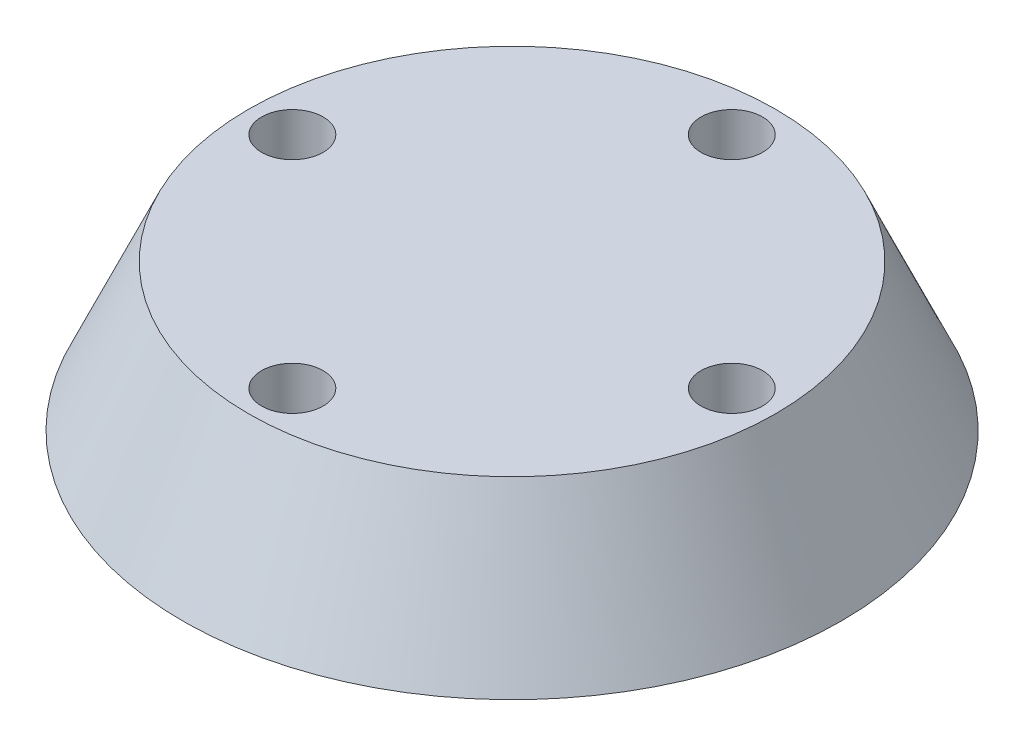
ISO-10303-21;
HEADER;
FILE_DESCRIPTION(('STEP AP214'),'2;1');
FILE_NAME('part.step','',(''),(''),'','','');
FILE_SCHEMA(('AUTOMOTIVE_DESIGN { 1 0 10303 214 1 1 1 1 }'));
ENDSEC;
DATA;
#1=APPLICATION_CONTEXT('core data for automotive mechanical design processes');
#2=APPLICATION_PROTOCOL_DEFINITION('international standard','automotive_design',2000,#1);
#3=PRODUCT_CONTEXT('',#1,'mechanical');
#4=PRODUCT('Part','Part','',(#3));
#5=PRODUCT_RELATED_PRODUCT_CATEGORY('part','',(#4));
#6=PRODUCT_DEFINITION_FORMATION('','',#4);
#7=PRODUCT_DEFINITION_CONTEXT('part definition',#1,'design');
#8=PRODUCT_DEFINITION('design','',#6,#7);
#9=PRODUCT_DEFINITION_SHAPE('','',#8);
#10=(LENGTH_UNIT() NAMED_UNIT(*) SI_UNIT(.MILLI.,.METRE.));
#11=(NAMED_UNIT(*) PLANE_ANGLE_UNIT() SI_UNIT($,.RADIAN.));
#12=(NAMED_UNIT(*) SI_UNIT($,.STERADIAN.) SOLID_ANGLE_UNIT());
#13=UNCERTAINTY_MEASURE_WITH_UNIT(LENGTH_MEASURE(1.E-05),#10,'distance_accuracy_value','');
#14=(GEOMETRIC_REPRESENTATION_CONTEXT(3) GLOBAL_UNCERTAINTY_ASSIGNED_CONTEXT((#13)) GLOBAL_UNIT_ASSIGNED_CONTEXT((#10,
#11,#12)) REPRESENTATION_CONTEXT('',''));
#15=CARTESIAN_POINT('',(0.,0.,0.));
#16=DIRECTION('',(0.,0.,1.));
#17=DIRECTION('',(1.,0.,0.));
#18=AXIS2_PLACEMENT_3D('',#15,#16,#17);
#19=CARTESIAN_POINT('',(0.,0.,0.));
#20=DIRECTION('',(0.,-1.,0.));
#21=DIRECTION('',(1.,0.,0.));
#22=AXIS2_PLACEMENT_3D('',#19,#20,#21);
#23=PLANE('',#22);
#24=CARTESIAN_POINT('',(15.,0.,0.));
#25=DIRECTION('',(0.,1.,0.));
#26=DIRECTION('',(-1.,0.,0.));
#27=AXIS2_PLACEMENT_3D('',#24,#25,#26);
#28=CIRCLE('',#27,2.1);
#29=CARTESIAN_POINT('',(12.9,0.,0.));
#30=VERTEX_POINT('',#29);
#31=EDGE_CURVE('E95',#30,#30,#28,.T.);
#32=ORIENTED_EDGE('',*,*,#31,.F.);
#33=EDGE_LOOP('',(#32));
#34=FACE_BOUND('',#33,.T.);
#35=CARTESIAN_POINT('',(-1.04744440165294E-13,0.,15.));
#36=DIRECTION('',(0.,1.,0.));
#37=DIRECTION('',(-1.,0.,0.));
#38=AXIS2_PLACEMENT_3D('',#35,#36,#37);
#39=CIRCLE('',#38,2.1);
#40=CARTESIAN_POINT('',(-2.1000000000001,0.,15.));
#41=VERTEX_POINT('',#40);
#42=EDGE_CURVE('E92',#41,#41,#39,.T.);
#43=ORIENTED_EDGE('',*,*,#42,.F.);
#44=EDGE_LOOP('',(#43));
#45=FACE_BOUND('',#44,.T.);
#46=CARTESIAN_POINT('',(0.,0.,-15.));
#47=DIRECTION('',(0.,1.,0.));
#48=DIRECTION('',(-1.,0.,0.));
#49=AXIS2_PLACEMENT_3D('',#46,#47,#48);
#50=CIRCLE('',#49,2.1);
#51=CARTESIAN_POINT('',(-2.1,0.,-15.));
#52=VERTEX_POINT('',#51);
#53=EDGE_CURVE('E86',#52,#52,#50,.T.);
#54=ORIENTED_EDGE('',*,*,#53,.F.);
#55=EDGE_LOOP('',(#54));
#56=FACE_BOUND('',#55,.T.);
#57=CARTESIAN_POINT('',(-15.,0.,-1.57116660247941E-13));
#58=DIRECTION('',(0.,1.,0.));
#59=DIRECTION('',(-1.,0.,0.));
#60=AXIS2_PLACEMENT_3D('',#57,#58,#59);
#61=CIRCLE('',#60,2.1);
#62=CARTESIAN_POINT('',(-17.1,0.,-1.57116660247941E-13));
#63=VERTEX_POINT('',#62);
#64=EDGE_CURVE('E80',#63,#63,#61,.T.);
#65=ORIENTED_EDGE('',*,*,#64,.F.);
#66=EDGE_LOOP('',(#65));
#67=FACE_BOUND('',#66,.T.);
#68=CARTESIAN_POINT('',(0.,0.,0.));
#69=DIRECTION('',(0.,-1.,0.));
#70=DIRECTION('',(1.,0.,0.));
#71=AXIS2_PLACEMENT_3D('',#68,#69,#70);
#72=CIRCLE('',#71,18.);
#73=CARTESIAN_POINT('',(18.,0.,0.));
#74=VERTEX_POINT('',#73);
#75=EDGE_CURVE('E10',#74,#74,#72,.T.);
#76=ORIENTED_EDGE('',*,*,#75,.F.);
#77=EDGE_LOOP('',(#76));
#78=FACE_BOUND('',#77,.T.);
#79=ADVANCED_FACE('F39',(#34,#45,#56,#67,#78),#23,.F.);
#80=CARTESIAN_POINT('',(0.,0.,0.));
#81=DIRECTION('',(0.,-1.,0.));
#82=DIRECTION('',(1.,0.,0.));
#83=AXIS2_PLACEMENT_3D('',#80,#81,#82);
#84=CONICAL_SURFACE('',#83,18.,0.42285392613294);
#85=CARTESIAN_POINT('',(0.,-10.,0.));
#86=DIRECTION('',(0.,-1.,0.));
#87=DIRECTION('',(1.,0.,0.));
#88=AXIS2_PLACEMENT_3D('',#85,#86,#87);
#89=CIRCLE('',#88,22.5);
#90=CARTESIAN_POINT('',(22.5,-10.,0.));
#91=VERTEX_POINT('',#90);
#92=EDGE_CURVE('E45',#91,#91,#89,.T.);
#93=ORIENTED_EDGE('',*,*,#92,.F.);
#94=EDGE_LOOP('',(#93));
#95=FACE_BOUND('',#94,.T.);
#96=ORIENTED_EDGE('',*,*,#75,.T.);
#97=EDGE_LOOP('',(#96));
#98=FACE_BOUND('',#97,.T.);
#99=ADVANCED_FACE('F112',(#95,#98),#84,.T.);
#100=CARTESIAN_POINT('',(22.5,-9.99999999999999,0.));
#101=DIRECTION('',(0.,1.,0.));
#102=DIRECTION('',(-1.,0.,0.));
#103=AXIS2_PLACEMENT_3D('',#100,#101,#102);
#104=PLANE('',#103);
#105=CARTESIAN_POINT('',(0.,-10.,18.));
#106=DIRECTION('',(0.,1.,0.));
#107=DIRECTION('',(0.,0.,1.));
#108=AXIS2_PLACEMENT_3D('',#105,#106,#107);
#109=CIRCLE('',#108,2.1);
#110=CARTESIAN_POINT('',(0.,-10.,20.1));
#111=VERTEX_POINT('',#110);
#112=EDGE_CURVE('E53',#111,#111,#109,.T.);
#113=ORIENTED_EDGE('',*,*,#112,.T.);
#114=EDGE_LOOP('',(#113));
#115=FACE_BOUND('',#114,.T.);
#116=CARTESIAN_POINT('',(-18.,-10.,0.));
#117=DIRECTION('',(0.,1.,0.));
#118=DIRECTION('',(0.,0.,1.));
#119=AXIS2_PLACEMENT_3D('',#116,#117,#118);
#120=CIRCLE('',#119,2.1);
#121=CARTESIAN_POINT('',(-18.,-10.,2.1));
#122=VERTEX_POINT('',#121);
#123=EDGE_CURVE('E72',#122,#122,#120,.T.);
#124=ORIENTED_EDGE('',*,*,#123,.T.);
#125=EDGE_LOOP('',(#124));
#126=FACE_BOUND('',#125,.T.);
#127=CARTESIAN_POINT('',(0.,-10.,-18.));
#128=DIRECTION('',(0.,1.,0.));
#129=DIRECTION('',(0.,0.,1.));
#130=AXIS2_PLACEMENT_3D('',#127,#128,#129);
#131=CIRCLE('',#130,2.1);
#132=CARTESIAN_POINT('',(0.,-10.,-15.9));
#133=VERTEX_POINT('',#132);
#134=EDGE_CURVE('E66',#133,#133,#131,.T.);
#135=ORIENTED_EDGE('',*,*,#134,.T.);
#136=EDGE_LOOP('',(#135));
#137=FACE_BOUND('',#136,.T.);
#138=CARTESIAN_POINT('',(18.,-10.,0.));
#139=DIRECTION('',(0.,1.,0.));
#140=DIRECTION('',(0.,0.,1.));
#141=AXIS2_PLACEMENT_3D('',#138,#139,#140);
#142=CIRCLE('',#141,2.1);
#143=CARTESIAN_POINT('',(18.,-10.,2.1));
#144=VERTEX_POINT('',#143);
#145=EDGE_CURVE('E59',#144,#144,#142,.T.);
#146=ORIENTED_EDGE('',*,*,#145,.T.);
#147=EDGE_LOOP('',(#146));
#148=FACE_BOUND('',#147,.T.);
#149=ORIENTED_EDGE('',*,*,#92,.T.);
#150=EDGE_LOOP('',(#149));
#151=FACE_BOUND('',#150,.T.);
#152=ADVANCED_FACE('F164',(#115,#126,#137,#148,#151),#104,.F.);
#153=CARTESIAN_POINT('',(18.,-6.,0.));
#154=DIRECTION('',(0.,-1.,0.));
#155=DIRECTION('',(0.,0.,-1.));
#156=AXIS2_PLACEMENT_3D('',#153,#154,#155);
#157=CYLINDRICAL_SURFACE('',#156,2.1);
#158=CARTESIAN_POINT('',(18.,-6.,0.));
#159=DIRECTION('',(0.,1.,0.));
#160=DIRECTION('',(0.,0.,1.));
#161=AXIS2_PLACEMENT_3D('',#158,#159,#160);
#162=CIRCLE('',#161,2.1);
#163=CARTESIAN_POINT('',(18.,-6.,2.1));
#164=VERTEX_POINT('',#163);
#165=EDGE_CURVE('E56',#164,#164,#162,.T.);
#166=ORIENTED_EDGE('',*,*,#165,.T.);
#167=EDGE_LOOP('',(#166));
#168=FACE_BOUND('',#167,.T.);
#169=ORIENTED_EDGE('',*,*,#145,.F.);
#170=EDGE_LOOP('',(#169));
#171=FACE_BOUND('',#170,.T.);
#172=ADVANCED_FACE('F161',(#168,#171),#157,.F.);
#173=CARTESIAN_POINT('',(18.,-6.,0.));
#174=DIRECTION('',(0.,1.,0.));
#175=DIRECTION('',(0.,0.,1.));
#176=AXIS2_PLACEMENT_3D('',#173,#174,#175);
#177=PLANE('',#176);
#178=ORIENTED_EDGE('',*,*,#165,.F.);
#179=EDGE_LOOP('',(#178));
#180=FACE_BOUND('',#179,.T.);
#181=ADVANCED_FACE('F156',(#180),#177,.F.);
#182=CARTESIAN_POINT('',(0.,-6.,-18.));
#183=DIRECTION('',(0.,-1.,0.));
#184=DIRECTION('',(0.,0.,-1.));
#185=AXIS2_PLACEMENT_3D('',#182,#183,#184);
#186=CYLINDRICAL_SURFACE('',#185,2.1);
#187=CARTESIAN_POINT('',(0.,-6.,-18.));
#188=DIRECTION('',(0.,1.,0.));
#189=DIRECTION('',(0.,0.,1.));
#190=AXIS2_PLACEMENT_3D('',#187,#188,#189);
#191=CIRCLE('',#190,2.1);
#192=CARTESIAN_POINT('',(0.,-6.,-15.9));
#193=VERTEX_POINT('',#192);
#194=EDGE_CURVE('E63',#193,#193,#191,.T.);
#195=ORIENTED_EDGE('',*,*,#194,.T.);
#196=EDGE_LOOP('',(#195));
#197=FACE_BOUND('',#196,.T.);
#198=ORIENTED_EDGE('',*,*,#134,.F.);
#199=EDGE_LOOP('',(#198));
#200=FACE_BOUND('',#199,.T.);
#201=ADVANCED_FACE('F153',(#197,#200),#186,.F.);
#202=CARTESIAN_POINT('',(0.,-6.,-18.));
#203=DIRECTION('',(0.,1.,0.));
#204=DIRECTION('',(0.,0.,1.));
#205=AXIS2_PLACEMENT_3D('',#202,#203,#204);
#206=PLANE('',#205);
#207=ORIENTED_EDGE('',*,*,#194,.F.);
#208=EDGE_LOOP('',(#207));
#209=FACE_BOUND('',#208,.T.);
#210=ADVANCED_FACE('F148',(#209),#206,.F.);
#211=CARTESIAN_POINT('',(-18.,-6.,0.));
#212=DIRECTION('',(0.,-1.,0.));
#213=DIRECTION('',(0.,0.,-1.));
#214=AXIS2_PLACEMENT_3D('',#211,#212,#213);
#215=CYLINDRICAL_SURFACE('',#214,2.1);
#216=CARTESIAN_POINT('',(-18.,-6.,0.));
#217=DIRECTION('',(0.,1.,0.));
#218=DIRECTION('',(0.,0.,1.));
#219=AXIS2_PLACEMENT_3D('',#216,#217,#218);
#220=CIRCLE('',#219,2.1);
#221=CARTESIAN_POINT('',(-18.,-6.,2.1));
#222=VERTEX_POINT('',#221);
#223=EDGE_CURVE('E69',#222,#222,#220,.T.);
#224=ORIENTED_EDGE('',*,*,#223,.T.);
#225=EDGE_LOOP('',(#224));
#226=FACE_BOUND('',#225,.T.);
#227=ORIENTED_EDGE('',*,*,#123,.F.);
#228=EDGE_LOOP('',(#227));
#229=FACE_BOUND('',#228,.T.);
#230=ADVANCED_FACE('F145',(#226,#229),#215,.F.);
#231=CARTESIAN_POINT('',(-18.,-6.,0.));
#232=DIRECTION('',(0.,1.,0.));
#233=DIRECTION('',(0.,0.,1.));
#234=AXIS2_PLACEMENT_3D('',#231,#232,#233);
#235=PLANE('',#234);
#236=ORIENTED_EDGE('',*,*,#223,.F.);
#237=EDGE_LOOP('',(#236));
#238=FACE_BOUND('',#237,.T.);
#239=ADVANCED_FACE('F143',(#238),#235,.F.);
#240=CARTESIAN_POINT('',(0.,-6.,18.));
#241=DIRECTION('',(0.,-1.,0.));
#242=DIRECTION('',(0.,0.,-1.));
#243=AXIS2_PLACEMENT_3D('',#240,#241,#242);
#244=CYLINDRICAL_SURFACE('',#243,2.1);
#245=CARTESIAN_POINT('',(0.,-6.,18.));
#246=DIRECTION('',(0.,1.,0.));
#247=DIRECTION('',(0.,0.,1.));
#248=AXIS2_PLACEMENT_3D('',#245,#246,#247);
#249=CIRCLE('',#248,2.1);
#250=CARTESIAN_POINT('',(0.,-6.,20.1));
#251=VERTEX_POINT('',#250);
#252=EDGE_CURVE('E49',#251,#251,#249,.T.);
#253=ORIENTED_EDGE('',*,*,#252,.T.);
#254=EDGE_LOOP('',(#253));
#255=FACE_BOUND('',#254,.T.);
#256=ORIENTED_EDGE('',*,*,#112,.F.);
#257=EDGE_LOOP('',(#256));
#258=FACE_BOUND('',#257,.T.);
#259=ADVANCED_FACE('F133',(#255,#258),#244,.F.);
#260=CARTESIAN_POINT('',(0.,-6.,18.));
#261=DIRECTION('',(0.,1.,0.));
#262=DIRECTION('',(0.,0.,1.));
#263=AXIS2_PLACEMENT_3D('',#260,#261,#262);
#264=PLANE('',#263);
#265=ORIENTED_EDGE('',*,*,#252,.F.);
#266=EDGE_LOOP('',(#265));
#267=FACE_BOUND('',#266,.T.);
#268=ADVANCED_FACE('F123',(#267),#264,.F.);
#269=CARTESIAN_POINT('',(-15.,-4.00000000000001,-1.57116660247941E-13));
#270=DIRECTION('',(0.,1.,0.));
#271=DIRECTION('',(-1.,0.,0.));
#272=AXIS2_PLACEMENT_3D('',#269,#270,#271);
#273=CYLINDRICAL_SURFACE('',#272,2.1);
#274=CARTESIAN_POINT('',(-15.,-4.00000000000001,-1.57116660247941E-13));
#275=DIRECTION('',(0.,1.,0.));
#276=DIRECTION('',(-1.,0.,0.));
#277=AXIS2_PLACEMENT_3D('',#274,#275,#276);
#278=CIRCLE('',#277,2.1);
#279=CARTESIAN_POINT('',(-17.1,-4.00000000000001,-1.57116660247941E-13));
#280=VERTEX_POINT('',#279);
#281=EDGE_CURVE('E77',#280,#280,#278,.T.);
#282=ORIENTED_EDGE('',*,*,#281,.F.);
#283=EDGE_LOOP('',(#282));
#284=FACE_BOUND('',#283,.T.);
#285=ORIENTED_EDGE('',*,*,#64,.T.);
#286=EDGE_LOOP('',(#285));
#287=FACE_BOUND('',#286,.T.);
#288=ADVANCED_FACE('F120',(#284,#287),#273,.F.);
#289=CARTESIAN_POINT('',(-15.,-4.00000000000001,-1.57116660247941E-13));
#290=DIRECTION('',(0.,1.,0.));
#291=DIRECTION('',(-1.,0.,0.));
#292=AXIS2_PLACEMENT_3D('',#289,#290,#291);
#293=PLANE('',#292);
#294=ORIENTED_EDGE('',*,*,#281,.T.);
#295=EDGE_LOOP('',(#294));
#296=FACE_BOUND('',#295,.T.);
#297=ADVANCED_FACE('F122',(#296),#293,.T.);
#298=CARTESIAN_POINT('',(0.,-4.,-15.));
#299=DIRECTION('',(0.,1.,0.));
#300=DIRECTION('',(-1.,0.,0.));
#301=AXIS2_PLACEMENT_3D('',#298,#299,#300);
#302=CYLINDRICAL_SURFACE('',#301,2.1);
#303=CARTESIAN_POINT('',(0.,-4.,-15.));
#304=DIRECTION('',(0.,1.,0.));
#305=DIRECTION('',(-1.,0.,0.));
#306=AXIS2_PLACEMENT_3D('',#303,#304,#305);
#307=CIRCLE('',#306,2.1);
#308=CARTESIAN_POINT('',(-2.1,-4.,-15.));
#309=VERTEX_POINT('',#308);
#310=EDGE_CURVE('E83',#309,#309,#307,.T.);
#311=ORIENTED_EDGE('',*,*,#310,.F.);
#312=EDGE_LOOP('',(#311));
#313=FACE_BOUND('',#312,.T.);
#314=ORIENTED_EDGE('',*,*,#53,.T.);
#315=EDGE_LOOP('',(#314));
#316=FACE_BOUND('',#315,.T.);
#317=ADVANCED_FACE('F129',(#313,#316),#302,.F.);
#318=CARTESIAN_POINT('',(0.,-4.,-15.));
#319=DIRECTION('',(0.,1.,0.));
#320=DIRECTION('',(-1.,0.,0.));
#321=AXIS2_PLACEMENT_3D('',#318,#319,#320);
#322=PLANE('',#321);
#323=ORIENTED_EDGE('',*,*,#310,.T.);
#324=EDGE_LOOP('',(#323));
#325=FACE_BOUND('',#324,.T.);
#326=ADVANCED_FACE('F138',(#325),#322,.T.);
#327=CARTESIAN_POINT('',(-1.01968882603731E-13,-4.,15.));
#328=DIRECTION('',(0.,1.,0.));
#329=DIRECTION('',(-1.,0.,0.));
#330=AXIS2_PLACEMENT_3D('',#327,#328,#329);
#331=CYLINDRICAL_SURFACE('',#330,2.1);
#332=CARTESIAN_POINT('',(-1.01968882603731E-13,-4.,15.));
#333=DIRECTION('',(0.,1.,0.));
#334=DIRECTION('',(-1.,0.,0.));
#335=AXIS2_PLACEMENT_3D('',#332,#333,#334);
#336=CIRCLE('',#335,2.1);
#337=CARTESIAN_POINT('',(-2.1000000000001,-4.,15.));
#338=VERTEX_POINT('',#337);
#339=EDGE_CURVE('E89',#338,#338,#336,.T.);
#340=ORIENTED_EDGE('',*,*,#339,.F.);
#341=EDGE_LOOP('',(#340));
#342=FACE_BOUND('',#341,.T.);
#343=ORIENTED_EDGE('',*,*,#42,.T.);
#344=EDGE_LOOP('',(#343));
#345=FACE_BOUND('',#344,.T.);
#346=ADVANCED_FACE('F260',(#342,#345),#331,.F.);
#347=CARTESIAN_POINT('',(-1.01968882603731E-13,-4.,15.));
#348=DIRECTION('',(0.,1.,0.));
#349=DIRECTION('',(-1.,0.,0.));
#350=AXIS2_PLACEMENT_3D('',#347,#348,#349);
#351=PLANE('',#350);
#352=ORIENTED_EDGE('',*,*,#339,.T.);
#353=EDGE_LOOP('',(#352));
#354=FACE_BOUND('',#353,.T.);
#355=ADVANCED_FACE('F106',(#354),#351,.T.);
#356=CARTESIAN_POINT('',(15.,-3.99999999999999,0.));
#357=DIRECTION('',(0.,1.,0.));
#358=DIRECTION('',(-1.,0.,0.));
#359=AXIS2_PLACEMENT_3D('',#356,#357,#358);
#360=CYLINDRICAL_SURFACE('',#359,2.1);
#361=CARTESIAN_POINT('',(15.,-3.99999999999999,0.));
#362=DIRECTION('',(0.,1.,0.));
#363=DIRECTION('',(-1.,0.,0.));
#364=AXIS2_PLACEMENT_3D('',#361,#362,#363);
#365=CIRCLE('',#364,2.1);
#366=CARTESIAN_POINT('',(12.9,-3.99999999999999,0.));
#367=VERTEX_POINT('',#366);
#368=EDGE_CURVE('E60',#367,#367,#365,.T.);
#369=ORIENTED_EDGE('',*,*,#368,.F.);
#370=EDGE_LOOP('',(#369));
#371=FACE_BOUND('',#370,.T.);
#372=ORIENTED_EDGE('',*,*,#31,.T.);
#373=EDGE_LOOP('',(#372));
#374=FACE_BOUND('',#373,.T.);
#375=ADVANCED_FACE('F103',(#371,#374),#360,.F.);
#376=CARTESIAN_POINT('',(15.,-3.99999999999999,0.));
#377=DIRECTION('',(0.,1.,0.));
#378=DIRECTION('',(-1.,0.,0.));
#379=AXIS2_PLACEMENT_3D('',#376,#377,#378);
#380=PLANE('',#379);
#381=ORIENTED_EDGE('',*,*,#368,.T.);
#382=EDGE_LOOP('',(#381));
#383=FACE_BOUND('',#382,.T.);
#384=ADVANCED_FACE('F101',(#383),#380,.T.);
#385=CLOSED_SHELL('',(#79,#99,#152,#172,#181,#201,#210,#230,#239,#259,#268,#288,#297,#317,#326,
#346,#355,#375,#384));
#386=MANIFOLD_SOLID_BREP('B2',#385);
#387=ADVANCED_BREP_SHAPE_REPRESENTATION('',(#18,#386),#14);
#388=SHAPE_DEFINITION_REPRESENTATION(#9,#387);
ENDSEC;
END-ISO-10303-21;
